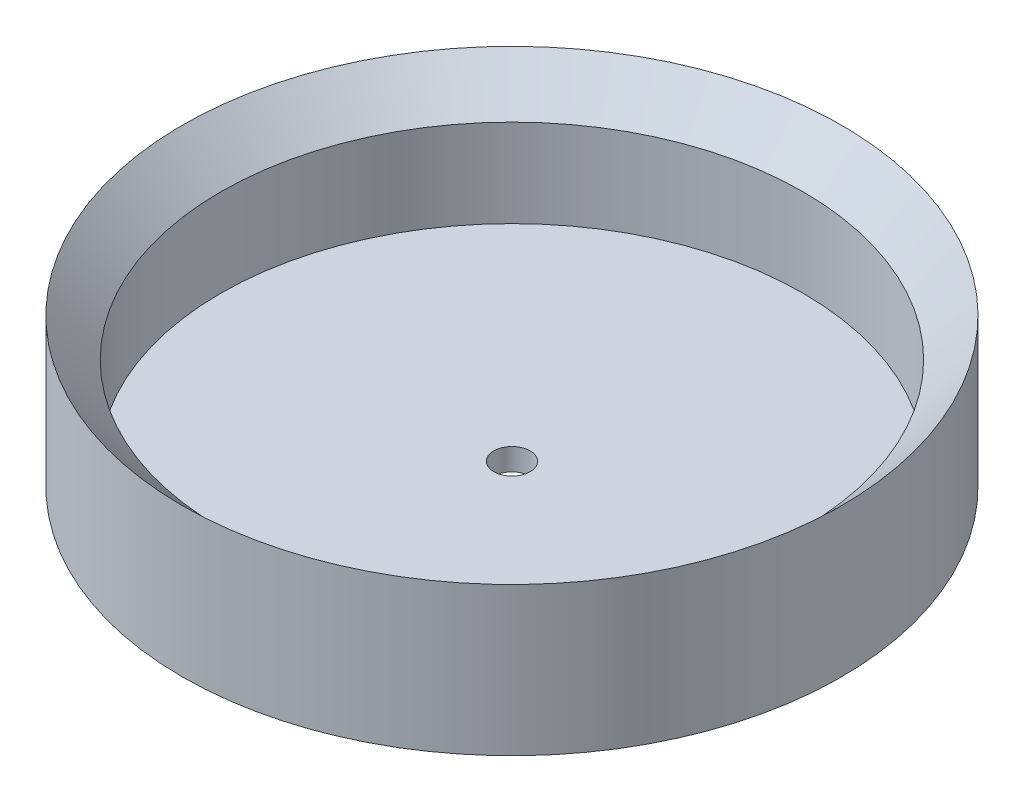
ISO-10303-21;
HEADER;
FILE_DESCRIPTION(('STEP AP214'),'2;1');
FILE_NAME('part.step','',(''),(''),'','','');
FILE_SCHEMA(('AUTOMOTIVE_DESIGN { 1 0 10303 214 1 1 1 1 }'));
ENDSEC;
DATA;
#1=APPLICATION_CONTEXT('core data for automotive mechanical design processes');
#2=APPLICATION_PROTOCOL_DEFINITION('international standard','automotive_design',2000,#1);
#3=PRODUCT_CONTEXT('',#1,'mechanical');
#4=PRODUCT('Part','Part','',(#3));
#5=PRODUCT_RELATED_PRODUCT_CATEGORY('part','',(#4));
#6=PRODUCT_DEFINITION_FORMATION('','',#4);
#7=PRODUCT_DEFINITION_CONTEXT('part definition',#1,'design');
#8=PRODUCT_DEFINITION('design','',#6,#7);
#9=PRODUCT_DEFINITION_SHAPE('','',#8);
#10=(LENGTH_UNIT() NAMED_UNIT(*) SI_UNIT(.MILLI.,.METRE.));
#11=(NAMED_UNIT(*) PLANE_ANGLE_UNIT() SI_UNIT($,.RADIAN.));
#12=(NAMED_UNIT(*) SI_UNIT($,.STERADIAN.) SOLID_ANGLE_UNIT());
#13=UNCERTAINTY_MEASURE_WITH_UNIT(LENGTH_MEASURE(1.E-05),#10,'distance_accuracy_value','');
#14=(GEOMETRIC_REPRESENTATION_CONTEXT(3) GLOBAL_UNCERTAINTY_ASSIGNED_CONTEXT((#13)) GLOBAL_UNIT_ASSIGNED_CONTEXT((#10,
#11,#12)) REPRESENTATION_CONTEXT('',''));
#15=CARTESIAN_POINT('',(0.,0.,0.));
#16=DIRECTION('',(0.,0.,1.));
#17=DIRECTION('',(1.,0.,0.));
#18=AXIS2_PLACEMENT_3D('',#15,#16,#17);
#19=CARTESIAN_POINT('',(0.,15.,0.));
#20=DIRECTION('',(0.,-1.,0.));
#21=DIRECTION('',(0.,0.,-1.));
#22=AXIS2_PLACEMENT_3D('',#19,#20,#21);
#23=CYLINDRICAL_SURFACE('',#22,26.5);
#24=CARTESIAN_POINT('',(0.,9.99999999999991,0.));
#25=DIRECTION('',(0.,1.,0.));
#26=DIRECTION('',(0.,0.,1.));
#27=AXIS2_PLACEMENT_3D('',#24,#25,#26);
#28=CIRCLE('',#27,26.5);
#29=CARTESIAN_POINT('',(0.,9.99999999999991,26.5));
#30=VERTEX_POINT('',#29);
#31=EDGE_CURVE('E49',#30,#30,#28,.T.);
#32=ORIENTED_EDGE('',*,*,#31,.T.);
#33=EDGE_LOOP('',(#32));
#34=FACE_BOUND('',#33,.T.);
#35=CARTESIAN_POINT('',(0.,2.,0.));
#36=DIRECTION('',(0.,-1.,0.));
#37=DIRECTION('',(0.,0.,-1.));
#38=AXIS2_PLACEMENT_3D('',#35,#36,#37);
#39=CIRCLE('',#38,26.5);
#40=CARTESIAN_POINT('',(0.,2.,-26.5));
#41=VERTEX_POINT('',#40);
#42=EDGE_CURVE('E57',#41,#41,#39,.T.);
#43=ORIENTED_EDGE('',*,*,#42,.T.);
#44=EDGE_LOOP('',(#43));
#45=FACE_BOUND('',#44,.T.);
#46=ADVANCED_FACE('F41',(#34,#45),#23,.F.);
#47=CARTESIAN_POINT('',(0.,0.,0.));
#48=DIRECTION('',(0.,1.,0.));
#49=DIRECTION('',(0.,0.,1.));
#50=AXIS2_PLACEMENT_3D('',#47,#48,#49);
#51=PLANE('',#50);
#52=CARTESIAN_POINT('',(0.,0.,0.));
#53=DIRECTION('',(0.,1.,0.));
#54=DIRECTION('',(0.,0.,1.));
#55=AXIS2_PLACEMENT_3D('',#52,#53,#54);
#56=CIRCLE('',#55,1.65);
#57=CARTESIAN_POINT('',(0.,0.,1.65));
#58=VERTEX_POINT('',#57);
#59=EDGE_CURVE('E61',#58,#58,#56,.T.);
#60=ORIENTED_EDGE('',*,*,#59,.T.);
#61=EDGE_LOOP('',(#60));
#62=FACE_BOUND('',#61,.T.);
#63=CARTESIAN_POINT('',(0.,0.,0.));
#64=DIRECTION('',(0.,1.,0.));
#65=DIRECTION('',(0.,0.,1.));
#66=AXIS2_PLACEMENT_3D('',#63,#64,#65);
#67=CIRCLE('',#66,30.);
#68=CARTESIAN_POINT('',(0.,0.,30.));
#69=VERTEX_POINT('',#68);
#70=EDGE_CURVE('E53',#69,#69,#67,.T.);
#71=ORIENTED_EDGE('',*,*,#70,.F.);
#72=EDGE_LOOP('',(#71));
#73=FACE_BOUND('',#72,.T.);
#74=ADVANCED_FACE('F69',(#62,#73),#51,.F.);
#75=CARTESIAN_POINT('',(0.,15.,0.));
#76=DIRECTION('',(0.,-1.,0.));
#77=DIRECTION('',(0.,0.,-1.));
#78=AXIS2_PLACEMENT_3D('',#75,#76,#77);
#79=CYLINDRICAL_SURFACE('',#78,30.);
#80=CARTESIAN_POINT('',(0.,13.4999999999999,0.));
#81=DIRECTION('',(0.,1.,0.));
#82=DIRECTION('',(0.,0.,1.));
#83=AXIS2_PLACEMENT_3D('',#80,#81,#82);
#84=CIRCLE('',#83,30.);
#85=CARTESIAN_POINT('',(0.,13.4999999999999,30.));
#86=VERTEX_POINT('',#85);
#87=EDGE_CURVE('E10',#86,#86,#84,.F.);
#88=ORIENTED_EDGE('',*,*,#87,.T.);
#89=EDGE_LOOP('',(#88));
#90=FACE_BOUND('',#89,.T.);
#91=ORIENTED_EDGE('',*,*,#70,.T.);
#92=EDGE_LOOP('',(#91));
#93=FACE_BOUND('',#92,.T.);
#94=ADVANCED_FACE('F81',(#90,#93),#79,.T.);
#95=CARTESIAN_POINT('',(0.,2.,0.));
#96=DIRECTION('',(0.,-1.,0.));
#97=DIRECTION('',(0.,0.,-1.));
#98=AXIS2_PLACEMENT_3D('',#95,#96,#97);
#99=PLANE('',#98);
#100=CARTESIAN_POINT('',(0.,2.,0.));
#101=DIRECTION('',(0.,1.,0.));
#102=DIRECTION('',(0.,0.,1.));
#103=AXIS2_PLACEMENT_3D('',#100,#101,#102);
#104=CIRCLE('',#103,1.65);
#105=CARTESIAN_POINT('',(0.,2.,1.65));
#106=VERTEX_POINT('',#105);
#107=EDGE_CURVE('E63',#106,#106,#104,.T.);
#108=ORIENTED_EDGE('',*,*,#107,.F.);
#109=EDGE_LOOP('',(#108));
#110=FACE_BOUND('',#109,.T.);
#111=ORIENTED_EDGE('',*,*,#42,.F.);
#112=EDGE_LOOP('',(#111));
#113=FACE_BOUND('',#112,.T.);
#114=ADVANCED_FACE('F78',(#110,#113),#99,.F.);
#115=CARTESIAN_POINT('',(0.,9.99999999999991,0.));
#116=DIRECTION('',(0.,1.,0.));
#117=DIRECTION('',(0.,0.,1.));
#118=AXIS2_PLACEMENT_3D('',#115,#116,#117);
#119=CONICAL_SURFACE('',#118,26.5,0.785398163397443);
#120=ORIENTED_EDGE('',*,*,#87,.F.);
#121=EDGE_LOOP('',(#120));
#122=FACE_BOUND('',#121,.T.);
#123=ORIENTED_EDGE('',*,*,#31,.F.);
#124=EDGE_LOOP('',(#123));
#125=FACE_BOUND('',#124,.T.);
#126=ADVANCED_FACE('F44',(#122,#125),#119,.F.);
#127=CARTESIAN_POINT('',(0.,0.,0.));
#128=DIRECTION('',(0.,1.,0.));
#129=DIRECTION('',(0.,0.,1.));
#130=AXIS2_PLACEMENT_3D('',#127,#128,#129);
#131=CYLINDRICAL_SURFACE('',#130,1.65);
#132=ORIENTED_EDGE('',*,*,#59,.F.);
#133=EDGE_LOOP('',(#132));
#134=FACE_BOUND('',#133,.T.);
#135=ORIENTED_EDGE('',*,*,#107,.T.);
#136=EDGE_LOOP('',(#135));
#137=FACE_BOUND('',#136,.T.);
#138=ADVANCED_FACE('F72',(#134,#137),#131,.F.);
#139=CLOSED_SHELL('',(#46,#74,#94,#114,#126,#138));
#140=MANIFOLD_SOLID_BREP('B2',#139);
#141=ADVANCED_BREP_SHAPE_REPRESENTATION('',(#18,#140),#14);
#142=SHAPE_DEFINITION_REPRESENTATION(#9,#141);
ENDSEC;
END-ISO-10303-21;
